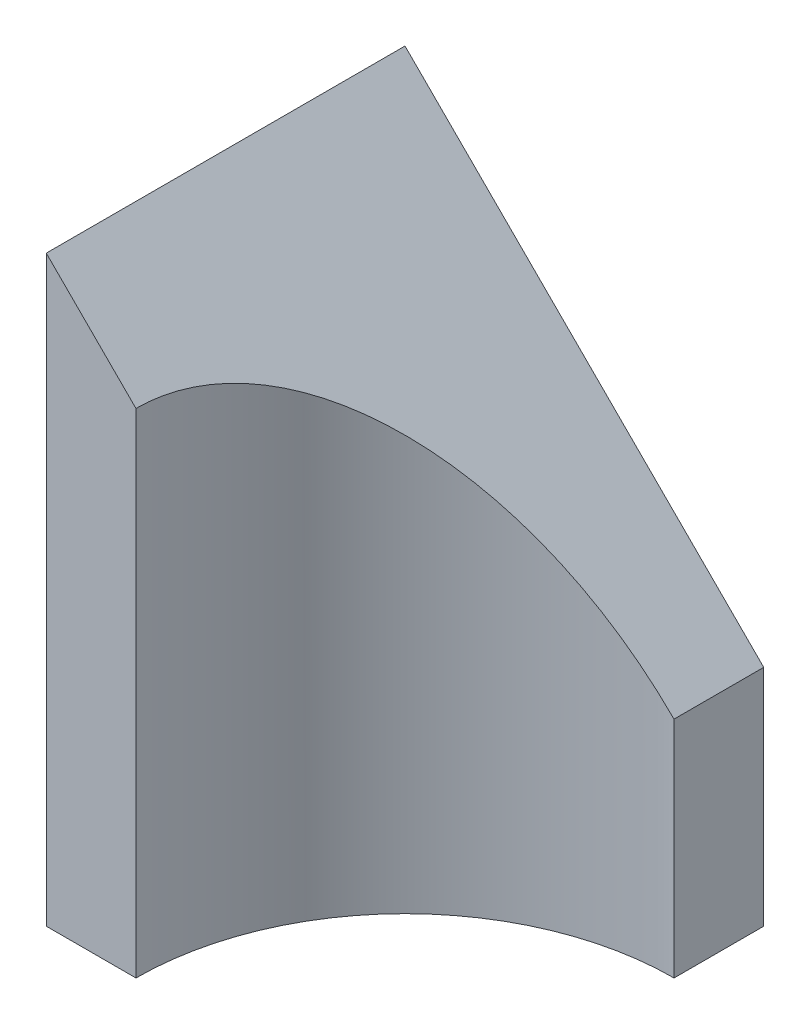
ISO-10303-21;
HEADER;
FILE_DESCRIPTION(('STEP AP214'),'2;1');
FILE_NAME('part.step','',(''),(''),'','','');
FILE_SCHEMA(('AUTOMOTIVE_DESIGN { 1 0 10303 214 1 1 1 1 }'));
ENDSEC;
DATA;
#1=APPLICATION_CONTEXT('core data for automotive mechanical design processes');
#2=APPLICATION_PROTOCOL_DEFINITION('international standard','automotive_design',2000,#1);
#3=PRODUCT_CONTEXT('',#1,'mechanical');
#4=PRODUCT('Part','Part','',(#3));
#5=PRODUCT_RELATED_PRODUCT_CATEGORY('part','',(#4));
#6=PRODUCT_DEFINITION_FORMATION('','',#4);
#7=PRODUCT_DEFINITION_CONTEXT('part definition',#1,'design');
#8=PRODUCT_DEFINITION('design','',#6,#7);
#9=PRODUCT_DEFINITION_SHAPE('','',#8);
#10=(LENGTH_UNIT() NAMED_UNIT(*) SI_UNIT(.MILLI.,.METRE.));
#11=(NAMED_UNIT(*) PLANE_ANGLE_UNIT() SI_UNIT($,.RADIAN.));
#12=(NAMED_UNIT(*) SI_UNIT($,.STERADIAN.) SOLID_ANGLE_UNIT());
#13=UNCERTAINTY_MEASURE_WITH_UNIT(LENGTH_MEASURE(1.E-05),#10,'distance_accuracy_value','');
#14=(GEOMETRIC_REPRESENTATION_CONTEXT(3) GLOBAL_UNCERTAINTY_ASSIGNED_CONTEXT((#13)) GLOBAL_UNIT_ASSIGNED_CONTEXT((#10,
#11,#12)) REPRESENTATION_CONTEXT('',''));
#15=CARTESIAN_POINT('',(0.,0.,0.));
#16=DIRECTION('',(0.,0.,1.));
#17=DIRECTION('',(1.,0.,0.));
#18=AXIS2_PLACEMENT_3D('',#15,#16,#17);
#19=CARTESIAN_POINT('',(50.8,82.55,0.));
#20=DIRECTION('',(0.,0.,1.));
#21=DIRECTION('',(1.,0.,0.));
#22=AXIS2_PLACEMENT_3D('',#19,#20,#21);
#23=PLANE('',#22);
#24=DIRECTION('',(-0.707106781186549,0.707106781186546,0.));
#25=VECTOR('',#24,1.);
#26=CARTESIAN_POINT('',(25.4000000000001,57.15,0.));
#27=LINE('',#26,#25);
#28=CARTESIAN_POINT('',(50.8,31.7500000000002,0.));
#29=VERTEX_POINT('',#28);
#30=CARTESIAN_POINT('',(0.,82.55,0.));
#31=VERTEX_POINT('',#30);
#32=EDGE_CURVE('E93',#29,#31,#27,.T.);
#33=ORIENTED_EDGE('',*,*,#32,.F.);
#34=DIRECTION('',(0.,-1.,0.));
#35=VECTOR('',#34,1.);
#36=CARTESIAN_POINT('',(50.8,82.55,0.));
#37=LINE('',#36,#35);
#38=CARTESIAN_POINT('',(50.8,0.,0.));
#39=VERTEX_POINT('',#38);
#40=EDGE_CURVE('E97',#29,#39,#37,.T.);
#41=ORIENTED_EDGE('',*,*,#40,.T.);
#42=DIRECTION('',(-1.,0.,0.));
#43=VECTOR('',#42,1.);
#44=CARTESIAN_POINT('',(50.8,0.,0.));
#45=LINE('',#44,#43);
#46=CARTESIAN_POINT('',(0.,0.,0.));
#47=VERTEX_POINT('',#46);
#48=EDGE_CURVE('E107',#39,#47,#45,.T.);
#49=ORIENTED_EDGE('',*,*,#48,.T.);
#50=DIRECTION('',(0.,-1.,0.));
#51=VECTOR('',#50,1.);
#52=CARTESIAN_POINT('',(0.,82.55,0.));
#53=LINE('',#52,#51);
#54=EDGE_CURVE('E11',#31,#47,#53,.T.);
#55=ORIENTED_EDGE('',*,*,#54,.F.);
#56=EDGE_LOOP('',(#33,#41,#49,#55));
#57=FACE_BOUND('',#56,.T.);
#58=ADVANCED_FACE('F33',(#57),#23,.F.);
#59=CARTESIAN_POINT('',(0.,82.55,50.8));
#60=DIRECTION('',(0.,0.,-1.));
#61=DIRECTION('',(-1.,0.,0.));
#62=AXIS2_PLACEMENT_3D('',#59,#60,#61);
#63=PLANE('',#62);
#64=DIRECTION('',(0.707106781186549,-0.707106781186546,0.));
#65=VECTOR('',#64,1.);
#66=CARTESIAN_POINT('',(0.,82.55,50.8));
#67=LINE('',#66,#65);
#68=CARTESIAN_POINT('',(0.,82.55,50.8));
#69=VERTEX_POINT('',#68);
#70=CARTESIAN_POINT('',(12.7,69.8500000000001,50.8));
#71=VERTEX_POINT('',#70);
#72=EDGE_CURVE('E90',#69,#71,#67,.T.);
#73=ORIENTED_EDGE('',*,*,#72,.F.);
#74=DIRECTION('',(0.,-1.,0.));
#75=VECTOR('',#74,1.);
#76=CARTESIAN_POINT('',(0.,82.55,50.8));
#77=LINE('',#76,#75);
#78=CARTESIAN_POINT('',(0.,0.,50.8));
#79=VERTEX_POINT('',#78);
#80=EDGE_CURVE('E40',#69,#79,#77,.T.);
#81=ORIENTED_EDGE('',*,*,#80,.T.);
#82=DIRECTION('',(1.,0.,0.));
#83=VECTOR('',#82,1.);
#84=CARTESIAN_POINT('',(0.,0.,50.8));
#85=LINE('',#84,#83);
#86=CARTESIAN_POINT('',(12.7,0.,50.8));
#87=VERTEX_POINT('',#86);
#88=EDGE_CURVE('E111',#79,#87,#85,.T.);
#89=ORIENTED_EDGE('',*,*,#88,.T.);
#90=DIRECTION('',(0.,-1.,0.));
#91=VECTOR('',#90,1.);
#92=CARTESIAN_POINT('',(12.7,82.55,50.8));
#93=LINE('',#92,#91);
#94=EDGE_CURVE('E88',#71,#87,#93,.T.);
#95=ORIENTED_EDGE('',*,*,#94,.F.);
#96=EDGE_LOOP('',(#73,#81,#89,#95));
#97=FACE_BOUND('',#96,.T.);
#98=ADVANCED_FACE('F91',(#97),#63,.F.);
#99=CARTESIAN_POINT('',(50.8,82.55,50.8));
#100=DIRECTION('',(0.,-1.,0.));
#101=DIRECTION('',(0.,0.,-1.));
#102=AXIS2_PLACEMENT_3D('',#99,#100,#101);
#103=CYLINDRICAL_SURFACE('',#102,38.1);
#104=CARTESIAN_POINT('',(50.8,31.7500000000002,50.8));
#105=DIRECTION('',(0.707106781186546,0.707106781186549,0.));
#106=DIRECTION('',(0.707106781186549,-0.707106781186546,0.));
#107=AXIS2_PLACEMENT_3D('',#104,#105,#106);
#108=ELLIPSE('',#107,53.8815367264148,38.1);
#109=CARTESIAN_POINT('',(50.8,31.7500000000002,12.7));
#110=VERTEX_POINT('',#109);
#111=EDGE_CURVE('E47',#71,#110,#108,.F.);
#112=ORIENTED_EDGE('',*,*,#111,.F.);
#113=ORIENTED_EDGE('',*,*,#94,.T.);
#114=CARTESIAN_POINT('',(50.8,0.,50.8));
#115=DIRECTION('',(0.,-1.,0.));
#116=DIRECTION('',(0.,0.,1.));
#117=AXIS2_PLACEMENT_3D('',#114,#115,#116);
#118=CIRCLE('',#117,38.1);
#119=CARTESIAN_POINT('',(50.8,0.,12.7));
#120=VERTEX_POINT('',#119);
#121=EDGE_CURVE('E103',#87,#120,#118,.T.);
#122=ORIENTED_EDGE('',*,*,#121,.T.);
#123=DIRECTION('',(0.,-1.,0.));
#124=VECTOR('',#123,1.);
#125=CARTESIAN_POINT('',(50.8,82.55,12.7));
#126=LINE('',#125,#124);
#127=EDGE_CURVE('E100',#110,#120,#126,.T.);
#128=ORIENTED_EDGE('',*,*,#127,.F.);
#129=EDGE_LOOP('',(#112,#113,#122,#128));
#130=FACE_BOUND('',#129,.T.);
#131=ADVANCED_FACE('F116',(#130),#103,.F.);
#132=CARTESIAN_POINT('',(50.8,82.55,12.7));
#133=DIRECTION('',(-1.,0.,0.));
#134=DIRECTION('',(0.,0.,1.));
#135=AXIS2_PLACEMENT_3D('',#132,#133,#134);
#136=PLANE('',#135);
#137=DIRECTION('',(0.,0.,-1.));
#138=VECTOR('',#137,1.);
#139=CARTESIAN_POINT('',(50.8,31.7500000000002,136.792398020687));
#140=LINE('',#139,#138);
#141=EDGE_CURVE('E55',#110,#29,#140,.T.);
#142=ORIENTED_EDGE('',*,*,#141,.F.);
#143=ORIENTED_EDGE('',*,*,#127,.T.);
#144=DIRECTION('',(0.,0.,-1.));
#145=VECTOR('',#144,1.);
#146=CARTESIAN_POINT('',(50.8,0.,12.7));
#147=LINE('',#146,#145);
#148=EDGE_CURVE('E98',#120,#39,#147,.T.);
#149=ORIENTED_EDGE('',*,*,#148,.T.);
#150=ORIENTED_EDGE('',*,*,#40,.F.);
#151=EDGE_LOOP('',(#142,#143,#149,#150));
#152=FACE_BOUND('',#151,.T.);
#153=ADVANCED_FACE('F122',(#152),#136,.F.);
#154=CARTESIAN_POINT('',(0.,82.55,0.));
#155=DIRECTION('',(1.,0.,0.));
#156=DIRECTION('',(0.,0.,-1.));
#157=AXIS2_PLACEMENT_3D('',#154,#155,#156);
#158=PLANE('',#157);
#159=DIRECTION('',(0.,0.,1.));
#160=VECTOR('',#159,1.);
#161=CARTESIAN_POINT('',(0.,0.,0.));
#162=LINE('',#161,#160);
#163=EDGE_CURVE('E84',#47,#79,#162,.T.);
#164=ORIENTED_EDGE('',*,*,#163,.T.);
#165=ORIENTED_EDGE('',*,*,#80,.F.);
#166=DIRECTION('',(0.,0.,1.));
#167=VECTOR('',#166,1.);
#168=CARTESIAN_POINT('',(0.,82.55,0.));
#169=LINE('',#168,#167);
#170=EDGE_CURVE('E82',#31,#69,#169,.T.);
#171=ORIENTED_EDGE('',*,*,#170,.F.);
#172=ORIENTED_EDGE('',*,*,#54,.T.);
#173=EDGE_LOOP('',(#164,#165,#171,#172));
#174=FACE_BOUND('',#173,.T.);
#175=ADVANCED_FACE('F80',(#174),#158,.F.);
#176=CARTESIAN_POINT('',(50.8,0.,50.8));
#177=DIRECTION('',(0.,1.,0.));
#178=DIRECTION('',(0.,0.,1.));
#179=AXIS2_PLACEMENT_3D('',#176,#177,#178);
#180=PLANE('',#179);
#181=ORIENTED_EDGE('',*,*,#48,.F.);
#182=ORIENTED_EDGE('',*,*,#148,.F.);
#183=ORIENTED_EDGE('',*,*,#121,.F.);
#184=ORIENTED_EDGE('',*,*,#88,.F.);
#185=ORIENTED_EDGE('',*,*,#163,.F.);
#186=EDGE_LOOP('',(#181,#182,#183,#184,#185));
#187=FACE_BOUND('',#186,.T.);
#188=ADVANCED_FACE('F121',(#187),#180,.F.);
#189=CARTESIAN_POINT('',(0.,82.55,136.792398020687));
#190=DIRECTION('',(0.707106781186546,0.707106781186549,0.));
#191=DIRECTION('',(-0.707106781186549,0.707106781186546,0.));
#192=AXIS2_PLACEMENT_3D('',#189,#190,#191);
#193=PLANE('',#192);
#194=ORIENTED_EDGE('',*,*,#141,.T.);
#195=ORIENTED_EDGE('',*,*,#32,.T.);
#196=ORIENTED_EDGE('',*,*,#170,.T.);
#197=ORIENTED_EDGE('',*,*,#72,.T.);
#198=ORIENTED_EDGE('',*,*,#111,.T.);
#199=EDGE_LOOP('',(#194,#195,#196,#197,#198));
#200=FACE_BOUND('',#199,.T.);
#201=ADVANCED_FACE('F96',(#200),#193,.T.);
#202=CLOSED_SHELL('',(#58,#98,#131,#153,#175,#188,#201));
#203=MANIFOLD_SOLID_BREP('B2',#202);
#204=ADVANCED_BREP_SHAPE_REPRESENTATION('',(#18,#203),#14);
#205=SHAPE_DEFINITION_REPRESENTATION(#9,#204);
ENDSEC;
END-ISO-10303-21;
